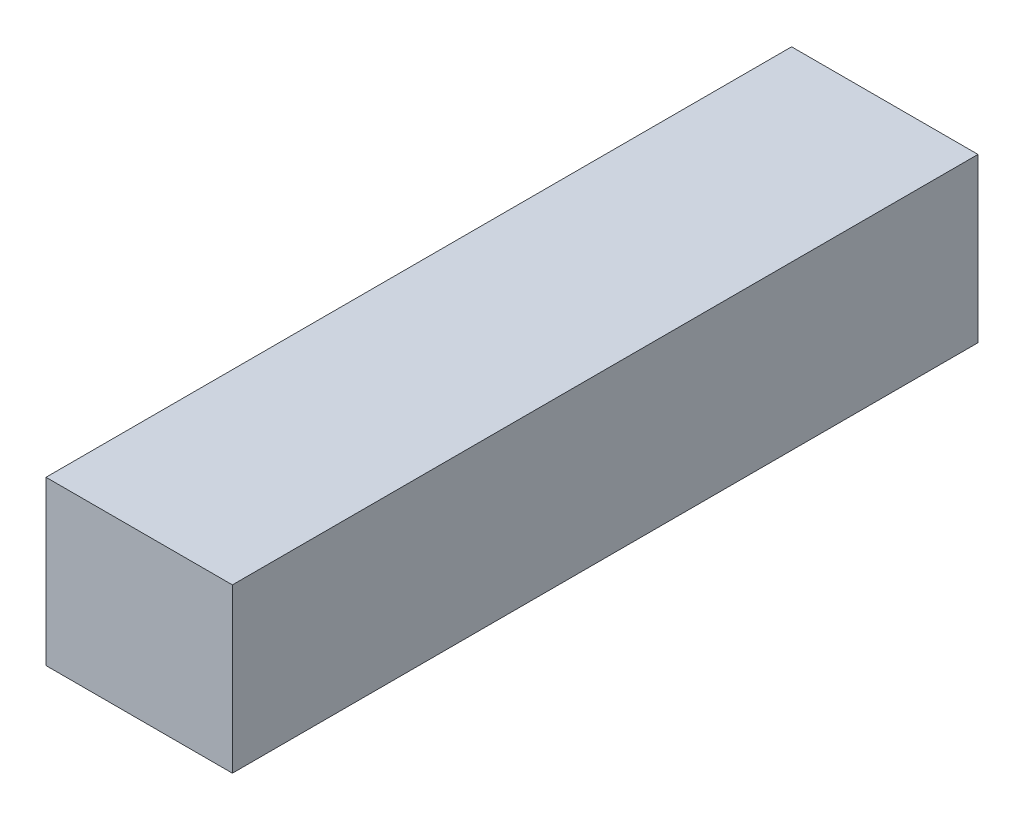
ISO-10303-21;
HEADER;
FILE_DESCRIPTION(('STEP AP214'),'2;1');
FILE_NAME('part.step','',(''),(''),'','','');
FILE_SCHEMA(('AUTOMOTIVE_DESIGN { 1 0 10303 214 1 1 1 1 }'));
ENDSEC;
DATA;
#1=APPLICATION_CONTEXT('core data for automotive mechanical design processes');
#2=APPLICATION_PROTOCOL_DEFINITION('international standard','automotive_design',2000,#1);
#3=PRODUCT_CONTEXT('',#1,'mechanical');
#4=PRODUCT('Part','Part','',(#3));
#5=PRODUCT_RELATED_PRODUCT_CATEGORY('part','',(#4));
#6=PRODUCT_DEFINITION_FORMATION('','',#4);
#7=PRODUCT_DEFINITION_CONTEXT('part definition',#1,'design');
#8=PRODUCT_DEFINITION('design','',#6,#7);
#9=PRODUCT_DEFINITION_SHAPE('','',#8);
#10=(LENGTH_UNIT() NAMED_UNIT(*) SI_UNIT(.MILLI.,.METRE.));
#11=(NAMED_UNIT(*) PLANE_ANGLE_UNIT() SI_UNIT($,.RADIAN.));
#12=(NAMED_UNIT(*) SI_UNIT($,.STERADIAN.) SOLID_ANGLE_UNIT());
#13=UNCERTAINTY_MEASURE_WITH_UNIT(LENGTH_MEASURE(1.E-05),#10,'distance_accuracy_value','');
#14=(GEOMETRIC_REPRESENTATION_CONTEXT(3) GLOBAL_UNCERTAINTY_ASSIGNED_CONTEXT((#13)) GLOBAL_UNIT_ASSIGNED_CONTEXT((#10,
#11,#12)) REPRESENTATION_CONTEXT('',''));
#15=CARTESIAN_POINT('',(0.,0.,0.));
#16=DIRECTION('',(0.,0.,1.));
#17=DIRECTION('',(1.,0.,0.));
#18=AXIS2_PLACEMENT_3D('',#15,#16,#17);
#19=CARTESIAN_POINT('',(4.,-3.5,32.));
#20=DIRECTION('',(-1.,0.,0.));
#21=DIRECTION('',(0.,0.,1.));
#22=AXIS2_PLACEMENT_3D('',#19,#20,#21);
#23=PLANE('',#22);
#24=DIRECTION('',(0.,1.,0.));
#25=VECTOR('',#24,1.);
#26=CARTESIAN_POINT('',(4.,-3.5,0.));
#27=LINE('',#26,#25);
#28=CARTESIAN_POINT('',(4.,-3.5,0.));
#29=VERTEX_POINT('',#28);
#30=CARTESIAN_POINT('',(4.,3.5,0.));
#31=VERTEX_POINT('',#30);
#32=EDGE_CURVE('E115',#29,#31,#27,.T.);
#33=ORIENTED_EDGE('',*,*,#32,.T.);
#34=DIRECTION('',(0.,0.,-1.));
#35=VECTOR('',#34,1.);
#36=CARTESIAN_POINT('',(4.,3.5,32.));
#37=LINE('',#36,#35);
#38=CARTESIAN_POINT('',(4.,3.5,32.));
#39=VERTEX_POINT('',#38);
#40=EDGE_CURVE('E11',#39,#31,#37,.T.);
#41=ORIENTED_EDGE('',*,*,#40,.F.);
#42=DIRECTION('',(0.,1.,0.));
#43=VECTOR('',#42,1.);
#44=CARTESIAN_POINT('',(4.,-3.5,32.));
#45=LINE('',#44,#43);
#46=CARTESIAN_POINT('',(4.,-3.5,32.));
#47=VERTEX_POINT('',#46);
#48=EDGE_CURVE('E98',#47,#39,#45,.T.);
#49=ORIENTED_EDGE('',*,*,#48,.F.);
#50=DIRECTION('',(0.,0.,-1.));
#51=VECTOR('',#50,1.);
#52=CARTESIAN_POINT('',(4.,-3.5,32.));
#53=LINE('',#52,#51);
#54=EDGE_CURVE('E111',#47,#29,#53,.T.);
#55=ORIENTED_EDGE('',*,*,#54,.T.);
#56=EDGE_LOOP('',(#33,#41,#49,#55));
#57=FACE_BOUND('',#56,.T.);
#58=ADVANCED_FACE('F38',(#57),#23,.F.);
#59=CARTESIAN_POINT('',(-4.,3.5,32.));
#60=DIRECTION('',(0.,-1.,0.));
#61=DIRECTION('',(0.,0.,-1.));
#62=AXIS2_PLACEMENT_3D('',#59,#60,#61);
#63=PLANE('',#62);
#64=DIRECTION('',(-1.,0.,0.));
#65=VECTOR('',#64,1.);
#66=CARTESIAN_POINT('',(-4.,3.5,0.));
#67=LINE('',#66,#65);
#68=CARTESIAN_POINT('',(-4.,3.5,0.));
#69=VERTEX_POINT('',#68);
#70=EDGE_CURVE('E103',#31,#69,#67,.T.);
#71=ORIENTED_EDGE('',*,*,#70,.T.);
#72=DIRECTION('',(0.,0.,-1.));
#73=VECTOR('',#72,1.);
#74=CARTESIAN_POINT('',(-4.,3.5,32.));
#75=LINE('',#74,#73);
#76=CARTESIAN_POINT('',(-4.,3.5,32.));
#77=VERTEX_POINT('',#76);
#78=EDGE_CURVE('E47',#77,#69,#75,.T.);
#79=ORIENTED_EDGE('',*,*,#78,.F.);
#80=DIRECTION('',(-1.,0.,0.));
#81=VECTOR('',#80,1.);
#82=CARTESIAN_POINT('',(-4.,3.5,32.));
#83=LINE('',#82,#81);
#84=EDGE_CURVE('E93',#39,#77,#83,.T.);
#85=ORIENTED_EDGE('',*,*,#84,.F.);
#86=ORIENTED_EDGE('',*,*,#40,.T.);
#87=EDGE_LOOP('',(#71,#79,#85,#86));
#88=FACE_BOUND('',#87,.T.);
#89=ADVANCED_FACE('F102',(#88),#63,.F.);
#90=CARTESIAN_POINT('',(-4.,-3.5,32.));
#91=DIRECTION('',(1.,0.,0.));
#92=DIRECTION('',(0.,0.,-1.));
#93=AXIS2_PLACEMENT_3D('',#90,#91,#92);
#94=PLANE('',#93);
#95=DIRECTION('',(0.,-1.,0.));
#96=VECTOR('',#95,1.);
#97=CARTESIAN_POINT('',(-4.,-3.5,0.));
#98=LINE('',#97,#96);
#99=CARTESIAN_POINT('',(-4.,-3.5,0.));
#100=VERTEX_POINT('',#99);
#101=EDGE_CURVE('E80',#69,#100,#98,.T.);
#102=ORIENTED_EDGE('',*,*,#101,.T.);
#103=DIRECTION('',(0.,0.,-1.));
#104=VECTOR('',#103,1.);
#105=CARTESIAN_POINT('',(-4.,-3.5,32.));
#106=LINE('',#105,#104);
#107=CARTESIAN_POINT('',(-4.,-3.5,32.));
#108=VERTEX_POINT('',#107);
#109=EDGE_CURVE('E105',#108,#100,#106,.T.);
#110=ORIENTED_EDGE('',*,*,#109,.F.);
#111=DIRECTION('',(0.,-1.,0.));
#112=VECTOR('',#111,1.);
#113=CARTESIAN_POINT('',(-4.,-3.5,32.));
#114=LINE('',#113,#112);
#115=EDGE_CURVE('E96',#77,#108,#114,.T.);
#116=ORIENTED_EDGE('',*,*,#115,.F.);
#117=ORIENTED_EDGE('',*,*,#78,.T.);
#118=EDGE_LOOP('',(#102,#110,#116,#117));
#119=FACE_BOUND('',#118,.T.);
#120=ADVANCED_FACE('F106',(#119),#94,.F.);
#121=CARTESIAN_POINT('',(-4.,-3.5,32.));
#122=DIRECTION('',(0.,1.,0.));
#123=DIRECTION('',(0.,0.,1.));
#124=AXIS2_PLACEMENT_3D('',#121,#122,#123);
#125=PLANE('',#124);
#126=DIRECTION('',(1.,0.,0.));
#127=VECTOR('',#126,1.);
#128=CARTESIAN_POINT('',(-4.,-3.5,0.));
#129=LINE('',#128,#127);
#130=EDGE_CURVE('E86',#100,#29,#129,.T.);
#131=ORIENTED_EDGE('',*,*,#130,.T.);
#132=ORIENTED_EDGE('',*,*,#54,.F.);
#133=DIRECTION('',(1.,0.,0.));
#134=VECTOR('',#133,1.);
#135=CARTESIAN_POINT('',(-4.,-3.5,32.));
#136=LINE('',#135,#134);
#137=EDGE_CURVE('E58',#108,#47,#136,.T.);
#138=ORIENTED_EDGE('',*,*,#137,.F.);
#139=ORIENTED_EDGE('',*,*,#109,.T.);
#140=EDGE_LOOP('',(#131,#132,#138,#139));
#141=FACE_BOUND('',#140,.T.);
#142=ADVANCED_FACE('F127',(#141),#125,.F.);
#143=CARTESIAN_POINT('',(0.,0.,32.));
#144=DIRECTION('',(0.,0.,-1.));
#145=DIRECTION('',(-1.,0.,0.));
#146=AXIS2_PLACEMENT_3D('',#143,#144,#145);
#147=PLANE('',#146);
#148=ORIENTED_EDGE('',*,*,#48,.T.);
#149=ORIENTED_EDGE('',*,*,#84,.T.);
#150=ORIENTED_EDGE('',*,*,#115,.T.);
#151=ORIENTED_EDGE('',*,*,#137,.T.);
#152=EDGE_LOOP('',(#148,#149,#150,#151));
#153=FACE_BOUND('',#152,.T.);
#154=ADVANCED_FACE('F94',(#153),#147,.F.);
#155=CARTESIAN_POINT('',(0.,0.,0.));
#156=DIRECTION('',(0.,0.,-1.));
#157=DIRECTION('',(-1.,0.,0.));
#158=AXIS2_PLACEMENT_3D('',#155,#156,#157);
#159=PLANE('',#158);
#160=ORIENTED_EDGE('',*,*,#32,.F.);
#161=ORIENTED_EDGE('',*,*,#130,.F.);
#162=ORIENTED_EDGE('',*,*,#101,.F.);
#163=ORIENTED_EDGE('',*,*,#70,.F.);
#164=EDGE_LOOP('',(#160,#161,#162,#163));
#165=FACE_BOUND('',#164,.T.);
#166=ADVANCED_FACE('F130',(#165),#159,.T.);
#167=CLOSED_SHELL('',(#58,#89,#120,#142,#154,#166));
#168=MANIFOLD_SOLID_BREP('B2',#167);
#169=ADVANCED_BREP_SHAPE_REPRESENTATION('',(#18,#168),#14);
#170=SHAPE_DEFINITION_REPRESENTATION(#9,#169);
ENDSEC;
END-ISO-10303-21;
